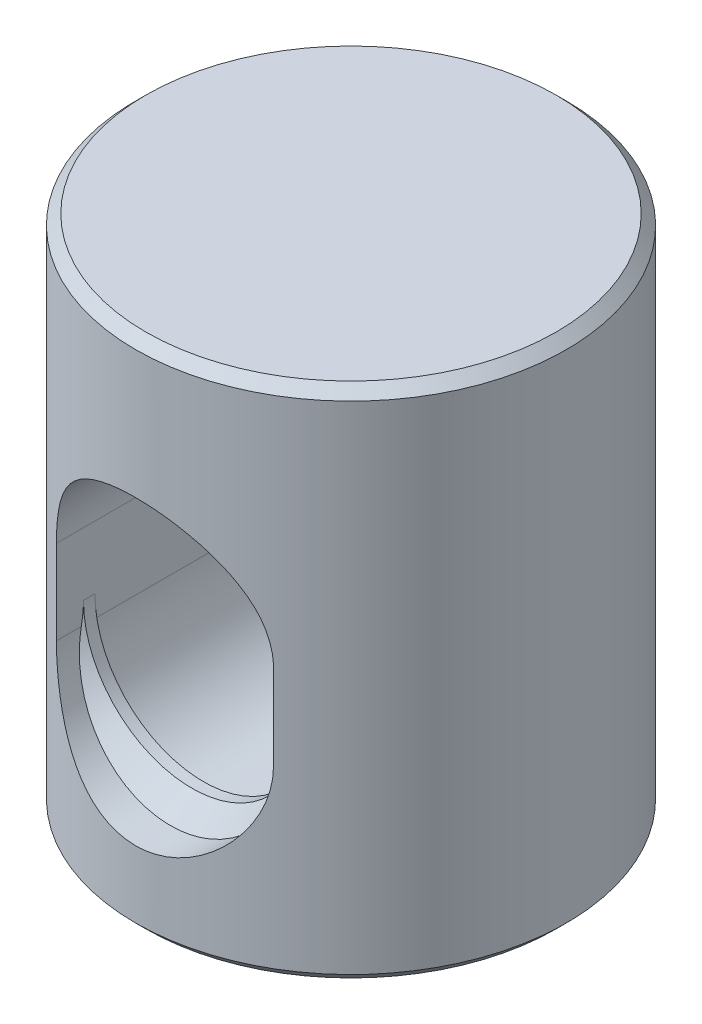
ISO-10303-21;
HEADER;
FILE_DESCRIPTION(('STEP AP214'),'2;1');
FILE_NAME('part.step','',(''),(''),'','','');
FILE_SCHEMA(('AUTOMOTIVE_DESIGN { 1 0 10303 214 1 1 1 1 }'));
ENDSEC;
DATA;
#1=APPLICATION_CONTEXT('core data for automotive mechanical design processes');
#2=APPLICATION_PROTOCOL_DEFINITION('international standard','automotive_design',2000,#1);
#3=PRODUCT_CONTEXT('',#1,'mechanical');
#4=PRODUCT('Part','Part','',(#3));
#5=PRODUCT_RELATED_PRODUCT_CATEGORY('part','',(#4));
#6=PRODUCT_DEFINITION_FORMATION('','',#4);
#7=PRODUCT_DEFINITION_CONTEXT('part definition',#1,'design');
#8=PRODUCT_DEFINITION('design','',#6,#7);
#9=PRODUCT_DEFINITION_SHAPE('','',#8);
#10=(LENGTH_UNIT() NAMED_UNIT(*) SI_UNIT(.MILLI.,.METRE.));
#11=(NAMED_UNIT(*) PLANE_ANGLE_UNIT() SI_UNIT($,.RADIAN.));
#12=(NAMED_UNIT(*) SI_UNIT($,.STERADIAN.) SOLID_ANGLE_UNIT());
#13=UNCERTAINTY_MEASURE_WITH_UNIT(LENGTH_MEASURE(1.E-05),#10,'distance_accuracy_value','');
#14=(GEOMETRIC_REPRESENTATION_CONTEXT(3) GLOBAL_UNCERTAINTY_ASSIGNED_CONTEXT((#13)) GLOBAL_UNIT_ASSIGNED_CONTEXT((#10,
#11,#12)) REPRESENTATION_CONTEXT('',''));
#15=CARTESIAN_POINT('',(0.,0.,0.));
#16=DIRECTION('',(0.,0.,1.));
#17=DIRECTION('',(1.,0.,0.));
#18=AXIS2_PLACEMENT_3D('',#15,#16,#17);
#19=CARTESIAN_POINT('',(0.,15.24,0.));
#20=DIRECTION('',(0.,-1.,0.));
#21=DIRECTION('',(0.,0.,-1.));
#22=AXIS2_PLACEMENT_3D('',#19,#20,#21);
#23=CYLINDRICAL_SURFACE('',#22,6.35);
#24=CARTESIAN_POINT('',(0.,0.300000000000012,0.));
#25=DIRECTION('',(0.,1.,0.));
#26=DIRECTION('',(0.,0.,1.));
#27=AXIS2_PLACEMENT_3D('',#24,#25,#26);
#28=CIRCLE('',#27,6.35);
#29=CARTESIAN_POINT('',(0.,0.300000000000012,6.35));
#30=VERTEX_POINT('',#29);
#31=EDGE_CURVE('E360',#30,#30,#28,.T.);
#32=ORIENTED_EDGE('',*,*,#31,.T.);
#33=EDGE_LOOP('',(#32));
#34=FACE_BOUND('',#33,.T.);
#35=CARTESIAN_POINT('',(0.,14.94,0.));
#36=DIRECTION('',(0.,1.,0.));
#37=DIRECTION('',(0.,0.,1.));
#38=AXIS2_PLACEMENT_3D('',#35,#36,#37);
#39=CIRCLE('',#38,6.35);
#40=CARTESIAN_POINT('',(0.,14.94,6.35));
#41=VERTEX_POINT('',#40);
#42=EDGE_CURVE('E260',#41,#41,#39,.F.);
#43=ORIENTED_EDGE('',*,*,#42,.T.);
#44=EDGE_LOOP('',(#43));
#45=FACE_BOUND('',#44,.T.);
#46=DIRECTION('',(0.,-1.,0.));
#47=VECTOR('',#46,1.);
#48=CARTESIAN_POINT('',(3.2004,15.24,5.48451819579441));
#49=LINE('',#48,#47);
#50=CARTESIAN_POINT('',(3.2004,7.96296381691838,5.48451819579441));
#51=VERTEX_POINT('',#50);
#52=CARTESIAN_POINT('',(3.2004,5.47376381691839,5.48451819579441));
#53=VERTEX_POINT('',#52);
#54=EDGE_CURVE('E323',#51,#53,#49,.T.);
#55=ORIENTED_EDGE('',*,*,#54,.T.);
#56=CARTESIAN_POINT('',(3.2004,5.47376381691839,5.48451819579441));
#57=CARTESIAN_POINT('',(3.20041520902536,5.39005199965933,5.48449322061247));
#58=CARTESIAN_POINT('',(3.19711609521049,5.30635408187406,5.48643413349997));
#59=CARTESIAN_POINT('',(3.18400896018501,5.13969204439521,5.49405961537088));
#60=CARTESIAN_POINT('',(3.17420501293031,5.05672749832797,5.49974184116526));
#61=CARTESIAN_POINT('',(3.14828323202816,4.89261017101105,5.51461890074698));
#62=CARTESIAN_POINT('',(3.13220242944823,4.8114496617991,5.5237931253167));
#63=CARTESIAN_POINT('',(3.09394053790969,4.65102430565194,5.54531450642794));
#64=CARTESIAN_POINT('',(3.0717587318152,4.57175968275794,5.55766203596096));
#65=CARTESIAN_POINT('',(2.99652270034001,4.33792381019741,5.59880664504087));
#66=CARTESIAN_POINT('',(2.93469640547812,4.18680593896513,5.6317555742814));
#67=CARTESIAN_POINT('',(2.7897444284642,3.89697972699356,5.70494487394591));
#68=CARTESIAN_POINT('',(2.7065851828588,3.75829141011306,5.74519670464981));
#69=CARTESIAN_POINT('',(2.51323770608714,3.48466268592874,5.83251973403245));
#70=CARTESIAN_POINT('',(2.40137654068711,3.35099367269663,5.87987966917263));
#71=CARTESIAN_POINT('',(2.15730197135361,3.10335125019217,5.97374636776074));
#72=CARTESIAN_POINT('',(2.02508299873944,2.98938324810154,6.02025289385955));
#73=CARTESIAN_POINT('',(1.73290070126351,2.77664460865887,6.11101485794577));
#74=CARTESIAN_POINT('',(1.57165365542979,2.67946147164897,6.15489459573024));
#75=CARTESIAN_POINT('',(1.23247156167235,2.51418725453053,6.23166593901807));
#76=CARTESIAN_POINT('',(1.05454715643542,2.44607777310111,6.26456449185763));
#77=CARTESIAN_POINT('',(0.700657533377402,2.34598995918221,6.3135686984548));
#78=CARTESIAN_POINT('',(0.525476355341838,2.31176021760063,6.33071428978728));
#79=CARTESIAN_POINT('',(0.171080993856966,2.27298119026403,6.35016927339731));
#80=CARTESIAN_POINT('',(-0.00813070434166761,2.26841409191865,6.35248756953939));
#81=CARTESIAN_POINT('',(-0.348541285139331,2.28823987151014,6.34251223547389));
#82=CARTESIAN_POINT('',(-0.509933100896632,2.3101105640801,6.33149107998425));
#83=CARTESIAN_POINT('',(-0.826389897083378,2.37766615729196,6.2980077559688));
#84=CARTESIAN_POINT('',(-0.981454523105129,2.42335238995521,6.27554494750421));
#85=CARTESIAN_POINT('',(-1.28353840976863,2.53751900553277,6.22084701388221));
#86=CARTESIAN_POINT('',(-1.43041885807273,2.60630219356663,6.18848260654502));
#87=CARTESIAN_POINT('',(-1.71090507374345,2.76427962589099,6.11688548974982));
#88=CARTESIAN_POINT('',(-1.84450589906419,2.85348142853425,6.07765023818021));
#89=CARTESIAN_POINT('',(-2.10826784413913,3.05955995787721,5.99155599301845));
#90=CARTESIAN_POINT('',(-2.23688028599883,3.17826672589359,5.94432675982627));
#91=CARTESIAN_POINT('',(-2.47322372003821,3.43507574816579,5.84994813553362));
#92=CARTESIAN_POINT('',(-2.58093539845394,3.57319574032218,5.80279885781512));
#93=CARTESIAN_POINT('',(-2.77941443378415,3.87618774753592,5.71052826545076));
#94=CARTESIAN_POINT('',(-2.86859541969828,4.04222343178092,5.66574587511273));
#95=CARTESIAN_POINT('',(-2.97986496162782,4.30249181580476,5.60755317221422));
#96=CARTESIAN_POINT('',(-3.01319221921256,4.39106482036819,5.58965986290572));
#97=CARTESIAN_POINT('',(-3.07201734030052,4.57140229489847,5.55754716941022));
#98=CARTESIAN_POINT('',(-3.09751825624147,4.66316550503245,5.5433263532177));
#99=CARTESIAN_POINT('',(-3.14579198551492,4.87301335466828,5.51610968460206));
#100=CARTESIAN_POINT('',(-3.16619715976677,4.99182508137017,5.504358329603));
#101=CARTESIAN_POINT('',(-3.18667870918506,5.17160794526524,5.49250697751061));
#102=CARTESIAN_POINT('',(-3.19181825016395,5.23186436455501,5.48951904322502));
#103=CARTESIAN_POINT('',(-3.19868021125493,5.35266181655497,5.48552216005222));
#104=CARTESIAN_POINT('',(-3.2004012042239,5.41320295756074,5.48451403768015));
#105=CARTESIAN_POINT('',(-3.2004,5.47376381691838,5.48451819579441));
#106=B_SPLINE_CURVE_WITH_KNOTS('',3,(#56,#57,#58,#59,#60,#61,#62,#63,#64,#65,#66,#67,#68,#69,
#70,#71,#72,#73,#74,#75,#76,#77,#78,#79,#80,#81,#82,#83,#84,#85,#86,#87,#88,#89,#90,#91,#92,#93,
#94,#95,#96,#97,#98,#99,#100,#101,#102,#103,#104,#105),.UNSPECIFIED.,.F.,.F.,(4,2,2,2,2,2,2,2,2,
2,2,2,2,2,2,2,2,2,2,2,2,2,2,2,4),(0.,0.251025201598788,0.501893335150696,0.751303283041319,
1.00074256009261,1.49809981011307,1.99624441090608,2.53582599156872,3.07555543262081,
3.65246126061753,4.22900140957668,4.76396393545721,5.29860518349389,5.78602567153319,
6.27347342429859,6.76757885089399,7.26186747698454,7.80338990036032,8.345410369809,
8.9231842497247,9.21175103862252,9.50020513695931,9.86246723499499,10.0440027069803,
10.2256139487637),.UNSPECIFIED.);
#107=CARTESIAN_POINT('',(-3.2004,5.47376381691839,5.48451819579441));
#108=VERTEX_POINT('',#107);
#109=EDGE_CURVE('E201',#53,#108,#106,.T.);
#110=ORIENTED_EDGE('',*,*,#109,.T.);
#111=DIRECTION('',(0.,-1.,0.));
#112=VECTOR('',#111,1.);
#113=CARTESIAN_POINT('',(-3.2004,15.24,5.48451819579441));
#114=LINE('',#113,#112);
#115=CARTESIAN_POINT('',(-3.2004,7.96296381691838,5.48451819579441));
#116=VERTEX_POINT('',#115);
#117=EDGE_CURVE('E214',#116,#108,#114,.T.);
#118=ORIENTED_EDGE('',*,*,#117,.F.);
#119=CARTESIAN_POINT('',(-3.2004,7.96296381691838,5.48451819579441));
#120=CARTESIAN_POINT('',(-3.20041520902536,8.04667563417744,5.48449322061247));
#121=CARTESIAN_POINT('',(-3.19711609521049,8.13037355196271,5.48643413349997));
#122=CARTESIAN_POINT('',(-3.18400896018501,8.29703558944157,5.49405961537088));
#123=CARTESIAN_POINT('',(-3.17420501293031,8.3800001355088,5.49974184116526));
#124=CARTESIAN_POINT('',(-3.14828323202816,8.54411746282572,5.51461890074698));
#125=CARTESIAN_POINT('',(-3.13220242944823,8.62527797203768,5.5237931253167));
#126=CARTESIAN_POINT('',(-3.09394053790969,8.78570332818483,5.54531450642794));
#127=CARTESIAN_POINT('',(-3.0717587318152,8.86496795107883,5.55766203596096));
#128=CARTESIAN_POINT('',(-2.99652270034001,9.09880382363936,5.59880664504087));
#129=CARTESIAN_POINT('',(-2.93469640547812,9.24992169487164,5.6317555742814));
#130=CARTESIAN_POINT('',(-2.78974442846419,9.53974790684321,5.70494487394591));
#131=CARTESIAN_POINT('',(-2.7065851828588,9.67843622372371,5.74519670464981));
#132=CARTESIAN_POINT('',(-2.51323770608714,9.95206494790803,5.83251973403245));
#133=CARTESIAN_POINT('',(-2.40137654068711,10.0857339611401,5.87987966917263));
#134=CARTESIAN_POINT('',(-2.15730197135361,10.3333763836446,5.97374636776074));
#135=CARTESIAN_POINT('',(-2.02508299873944,10.4473443857352,6.02025289385955));
#136=CARTESIAN_POINT('',(-1.73290070126351,10.6600830251779,6.11101485794577));
#137=CARTESIAN_POINT('',(-1.57165365542979,10.7572661621878,6.15489459573024));
#138=CARTESIAN_POINT('',(-1.23247156167234,10.9225403793062,6.23166593901807));
#139=CARTESIAN_POINT('',(-1.05454715643542,10.9906498607357,6.26456449185763));
#140=CARTESIAN_POINT('',(-0.700657533377399,11.0907376746546,6.3135686984548));
#141=CARTESIAN_POINT('',(-0.525476355341836,11.1249674162361,6.33071428978728));
#142=CARTESIAN_POINT('',(-0.171080993856964,11.1637464435727,6.35016927339731));
#143=CARTESIAN_POINT('',(0.00813070434166875,11.1683135419181,6.35248756953939));
#144=CARTESIAN_POINT('',(0.348541285139332,11.1484877623266,6.34251223547389));
#145=CARTESIAN_POINT('',(0.509933100896632,11.1266170697567,6.33149107998425));
#146=CARTESIAN_POINT('',(0.826389897083378,11.0590614765448,6.2980077559688));
#147=CARTESIAN_POINT('',(0.98145452310513,11.0133752438816,6.27554494750421));
#148=CARTESIAN_POINT('',(1.28353840976863,10.899208628304,6.22084701388221));
#149=CARTESIAN_POINT('',(1.43041885807273,10.8304254402701,6.18848260654502));
#150=CARTESIAN_POINT('',(1.71090507374345,10.6724480079458,6.11688548974982));
#151=CARTESIAN_POINT('',(1.84450589906419,10.5832462053025,6.07765023818021));
#152=CARTESIAN_POINT('',(2.10826784413913,10.3771676759596,5.99155599301845));
#153=CARTESIAN_POINT('',(2.23688028599883,10.2584609079432,5.94432675982627));
#154=CARTESIAN_POINT('',(2.47322372003821,10.001651885671,5.84994813553363));
#155=CARTESIAN_POINT('',(2.58093539845394,9.86353189351459,5.80279885781512));
#156=CARTESIAN_POINT('',(2.77941443378415,9.56053988630085,5.71052826545076));
#157=CARTESIAN_POINT('',(2.86859541969828,9.39450420205584,5.66574587511273));
#158=CARTESIAN_POINT('',(2.97986496162782,9.134235818032,5.60755317221422));
#159=CARTESIAN_POINT('',(3.01319221921256,9.04566281346857,5.58965986290572));
#160=CARTESIAN_POINT('',(3.07201734030052,8.8653253389383,5.55754716941022));
#161=CARTESIAN_POINT('',(3.09751825624147,8.77356212880431,5.5433263532177));
#162=CARTESIAN_POINT('',(3.14579198551492,8.56371427916849,5.51610968460206));
#163=CARTESIAN_POINT('',(3.16619715976677,8.4449025524666,5.504358329603));
#164=CARTESIAN_POINT('',(3.18667870918506,8.26511968857153,5.49250697751061));
#165=CARTESIAN_POINT('',(3.19181825016395,8.20486326928175,5.48951904322502));
#166=CARTESIAN_POINT('',(3.19868021125493,8.0840658172818,5.48552216005222));
#167=CARTESIAN_POINT('',(3.2004012042239,8.02352467627603,5.48451403768015));
#168=CARTESIAN_POINT('',(3.2004,7.96296381691838,5.48451819579441));
#169=B_SPLINE_CURVE_WITH_KNOTS('',3,(#119,#120,#121,#122,#123,#124,#125,#126,#127,#128,#129,
#130,#131,#132,#133,#134,#135,#136,#137,#138,#139,#140,#141,#142,#143,#144,#145,#146,#147,#148,
#149,#150,#151,#152,#153,#154,#155,#156,#157,#158,#159,#160,#161,#162,#163,#164,#165,#166,#167,
#168),.UNSPECIFIED.,.F.,.F.,(4,2,2,2,2,2,2,2,2,2,2,2,2,2,2,2,2,2,2,2,2,2,2,2,4),(0.,
0.251025201598788,0.501893335150699,0.75130328304132,1.00074256009261,1.49809981011307,
1.99624441090608,2.53582599156872,3.07555543262081,3.65246126061753,4.22900140957668,
4.76396393545721,5.29860518349389,5.78602567153319,6.27347342429859,6.76757885089399,
7.26186747698454,7.80338990036032,8.345410369809,8.92318424972471,9.21175103862252,
9.50020513695932,9.86246723499499,10.0440027069803,10.2256139487637),.UNSPECIFIED.);
#170=EDGE_CURVE('E208',#116,#51,#169,.T.);
#171=ORIENTED_EDGE('',*,*,#170,.T.);
#172=EDGE_LOOP('',(#55,#110,#118,#171));
#173=FACE_BOUND('',#172,.T.);
#174=DIRECTION('',(0.,-1.,0.));
#175=VECTOR('',#174,1.);
#176=CARTESIAN_POINT('',(3.2004,15.24,-5.48451819579441));
#177=LINE('',#176,#175);
#178=CARTESIAN_POINT('',(3.2004,7.96296381690808,-5.48451819579441));
#179=VERTEX_POINT('',#178);
#180=CARTESIAN_POINT('',(3.2004,5.47376381689446,-5.48451819579441));
#181=VERTEX_POINT('',#180);
#182=EDGE_CURVE('E125',#179,#181,#177,.T.);
#183=ORIENTED_EDGE('',*,*,#182,.F.);
#184=CARTESIAN_POINT('',(3.2004,7.96296381690808,-5.48451819579441));
#185=CARTESIAN_POINT('',(3.20041520902563,8.04667563416705,-5.48449322061231));
#186=CARTESIAN_POINT('',(3.19711609521104,8.13037355195224,-5.48643413349965));
#187=CARTESIAN_POINT('',(3.18400896018612,8.29703558943098,-5.49405961537024));
#188=CARTESIAN_POINT('',(3.17420501293171,8.38000013549817,-5.49974184116446));
#189=CARTESIAN_POINT('',(3.14828323203013,8.54411746281502,-5.51461890074585));
#190=CARTESIAN_POINT('',(3.1322024294505,8.62527797202696,-5.52379312531542));
#191=CARTESIAN_POINT('',(3.09394053791253,8.78570332817411,-5.54531450642635));
#192=CARTESIAN_POINT('',(3.07175873181834,8.86496795106813,-5.55766203595922));
#193=CARTESIAN_POINT('',(2.99652270034403,9.09880382362874,-5.59880664503872));
#194=CARTESIAN_POINT('',(2.93469640548273,9.24992169486112,-5.63175557427899));
#195=CARTESIAN_POINT('',(2.78974442846997,9.53974790683299,-5.70494487394308));
#196=CARTESIAN_POINT('',(2.70658518286516,9.67843622371367,-5.74519670464681));
#197=CARTESIAN_POINT('',(2.51323770609474,9.9520649478984,-5.83251973402917));
#198=CARTESIAN_POINT('',(2.40137654069538,10.0857339611308,-5.87987966916923));
#199=CARTESIAN_POINT('',(2.15730197136324,10.3333763836358,-5.97374636775725));
#200=CARTESIAN_POINT('',(2.02508299874975,10.4473443857268,-6.02025289385606));
#201=CARTESIAN_POINT('',(1.73290070127498,10.6600830251705,-6.11101485794251));
#202=CARTESIAN_POINT('',(1.57165365544169,10.7572661621811,-6.15489459572719));
#203=CARTESIAN_POINT('',(1.23247156168501,10.922540379301,-6.23166593901556));
#204=CARTESIAN_POINT('',(1.05454715644841,10.9906498607311,-6.26456449185544));
#205=CARTESIAN_POINT('',(0.700657533390645,11.0907376746516,-6.31356869845333));
#206=CARTESIAN_POINT('',(0.525476355355008,11.124967416234,-6.33071428978619));
#207=CARTESIAN_POINT('',(0.171080993869829,11.1637464435721,-6.35016927339697));
#208=CARTESIAN_POINT('',(-0.0081307043290376,11.1683135419182,-6.35248756953941));
#209=CARTESIAN_POINT('',(-0.348541285127142,11.148487762328,-6.34251223547456));
#210=CARTESIAN_POINT('',(-0.509933100884639,11.1266170697586,-6.33149107998522));
#211=CARTESIAN_POINT('',(-0.826389897071875,11.0590614765479,-6.29800775597032));
#212=CARTESIAN_POINT('',(-0.98145452309392,11.0133752438852,-6.27554494750597));
#213=CARTESIAN_POINT('',(-1.28353840975787,10.8992086283087,-6.22084701388443));
#214=CARTESIAN_POINT('',(-1.43041885806214,10.8304254402754,-6.18848260654747));
#215=CARTESIAN_POINT('',(-1.71090507373328,10.6724480079522,-6.11688548975267));
#216=CARTESIAN_POINT('',(-1.84450589905428,10.5832462053095,-6.07765023818322));
#217=CARTESIAN_POINT('',(-2.10826784412977,10.3771676759677,-5.99155599302174));
#218=CARTESIAN_POINT('',(-2.23688028598979,10.258460907952,-5.94432675982968));
#219=CARTESIAN_POINT('',(-2.4732237200299,10.001651885681,-5.84994813553714));
#220=CARTESIAN_POINT('',(-2.58093539844606,9.86353189352527,-5.80279885781863));
#221=CARTESIAN_POINT('',(-2.77941443377738,9.56053988631261,-5.71052826545406));
#222=CARTESIAN_POINT('',(-2.86859541969219,9.39450420206803,-5.66574587511583));
#223=CARTESIAN_POINT('',(-2.9798649616228,9.13423581804476,-5.60755317221689));
#224=CARTESIAN_POINT('',(-3.01319221920791,9.0456628134815,-5.58965986290822));
#225=CARTESIAN_POINT('',(-3.07201734029663,8.86532533895154,-5.55754716941238));
#226=CARTESIAN_POINT('',(-3.09751825623797,8.77356212881769,-5.54332635321965));
#227=CARTESIAN_POINT('',(-3.14579198551321,8.56371427917824,-5.51610968460304));
#228=CARTESIAN_POINT('',(-3.16619715976604,8.44490255247245,-5.50435832960343));
#229=CARTESIAN_POINT('',(-3.18667870918511,8.2651196885714,-5.49250697751058));
#230=CARTESIAN_POINT('',(-3.19181825016416,8.2048632692796,-5.48951904322491));
#231=CARTESIAN_POINT('',(-3.1986802112552,8.08406581727558,-5.48552216005206));
#232=CARTESIAN_POINT('',(-3.2004012042241,8.02352467626777,-5.48451403768004));
#233=CARTESIAN_POINT('',(-3.2004,7.96296381690809,-5.48451819579441));
#234=B_SPLINE_CURVE_WITH_KNOTS('',3,(#184,#185,#186,#187,#188,#189,#190,#191,#192,#193,#194,
#195,#196,#197,#198,#199,#200,#201,#202,#203,#204,#205,#206,#207,#208,#209,#210,#211,#212,#213,
#214,#215,#216,#217,#218,#219,#220,#221,#222,#223,#224,#225,#226,#227,#228,#229,#230,#231,#232,
#233),.UNSPECIFIED.,.F.,.F.,(4,2,2,2,2,2,2,2,2,2,2,2,2,2,2,2,2,2,2,2,2,2,2,2,4),(0.,
0.251025201598518,0.501893335150158,0.751303283040514,1.00074256009153,1.49809981011148,
1.99624441090397,2.53582599156581,3.07555543261711,3.65246126061389,4.22900140957311,
4.7639639354544,5.29860518349184,5.78602567153141,6.27347342429709,6.76757885089209,
7.26186747698224,7.80338990035736,8.34541036980537,8.92318424972106,9.21175103861887,
9.50020513695567,9.86246723500339,10.0440027069948,10.2256139487843),.UNSPECIFIED.);
#235=CARTESIAN_POINT('',(-3.2004,7.96296381690808,-5.48451819579441));
#236=VERTEX_POINT('',#235);
#237=EDGE_CURVE('E127',#179,#236,#234,.T.);
#238=ORIENTED_EDGE('',*,*,#237,.T.);
#239=DIRECTION('',(0.,-1.,0.));
#240=VECTOR('',#239,1.);
#241=CARTESIAN_POINT('',(-3.2004,15.24,-5.48451819579441));
#242=LINE('',#241,#240);
#243=CARTESIAN_POINT('',(-3.20040000002564,5.47376381689446,-5.48451819577945));
#244=VERTEX_POINT('',#243);
#245=EDGE_CURVE('E303',#236,#244,#242,.T.);
#246=ORIENTED_EDGE('',*,*,#245,.T.);
#247=CARTESIAN_POINT('',(3.2004,5.47376381689446,-5.48451819579441));
#248=CARTESIAN_POINT('',(3.20041520902473,5.39005199963519,-5.48449322061284));
#249=CARTESIAN_POINT('',(3.19711609520922,5.30635408184975,-5.48643413350071));
#250=CARTESIAN_POINT('',(3.18400896018244,5.13969204437061,-5.49405961537238));
#251=CARTESIAN_POINT('',(3.17420501292707,5.05672749830327,-5.49974184116713));
#252=CARTESIAN_POINT('',(3.14828323202358,4.89261017098621,-5.5146189007496));
#253=CARTESIAN_POINT('',(3.13220242944298,4.81144966177422,-5.52379312531968));
#254=CARTESIAN_POINT('',(3.09394053790307,4.65102430562705,-5.54531450643163));
#255=CARTESIAN_POINT('',(3.07175873180791,4.57175968273308,-5.557662035965));
#256=CARTESIAN_POINT('',(2.99652270033067,4.33792381017273,-5.59880664504589));
#257=CARTESIAN_POINT('',(2.93469640546742,4.18680593894069,-5.63175557428699));
#258=CARTESIAN_POINT('',(2.78974442845079,3.8969797269698,-5.70494487395249));
#259=CARTESIAN_POINT('',(2.70658518284405,3.75829141008974,-5.74519670465679));
#260=CARTESIAN_POINT('',(2.51323770606949,3.48466268590639,-5.83251973404009));
#261=CARTESIAN_POINT('',(2.40137654066788,3.35099367267484,-5.87987966918051));
#262=CARTESIAN_POINT('',(2.15730197133124,3.10335125017177,-5.97374636776885));
#263=CARTESIAN_POINT('',(2.02508299871549,2.98938324808197,-6.02025289386764));
#264=CARTESIAN_POINT('',(1.73290070123689,2.77664460864176,-6.11101485795335));
#265=CARTESIAN_POINT('',(1.57165365540214,2.67946147163341,-6.15489459573732));
#266=CARTESIAN_POINT('',(1.23247156164292,2.51418725451828,-6.23166593902391));
#267=CARTESIAN_POINT('',(1.05454715640525,2.4460777730906,-6.26456449186273));
#268=CARTESIAN_POINT('',(0.700657533346635,2.34598995917535,-6.31356869845821));
#269=CARTESIAN_POINT('',(0.525476355311241,2.31176021759558,-6.3307142897898));
#270=CARTESIAN_POINT('',(0.17108099382708,2.27298119026246,-6.35016927339811));
#271=CARTESIAN_POINT('',(-0.00813070437101219,2.26841409191876,-6.35248756953933));
#272=CARTESIAN_POINT('',(-0.348541285167653,2.28823987151325,-6.34251223547233));
#273=CARTESIAN_POINT('',(-0.509933100924496,2.31011056408461,-6.33149107998199));
#274=CARTESIAN_POINT('',(-0.826389897110103,2.3776661572991,-6.29800775596528));
#275=CARTESIAN_POINT('',(-0.981454523131173,2.42335238996361,-6.27554494750012));
#276=CARTESIAN_POINT('',(-1.28353840979363,2.53751900554369,-6.22084701387704));
#277=CARTESIAN_POINT('',(-1.43041885809733,2.60630219357889,-6.18848260653933));
#278=CARTESIAN_POINT('',(-1.71090507376706,2.76427962590589,-6.11688548974321));
#279=CARTESIAN_POINT('',(-1.84450589908722,2.85348142855044,-6.07765023817321));
#280=CARTESIAN_POINT('',(-2.10826784416087,3.05955995789616,-5.99155599301079));
#281=CARTESIAN_POINT('',(-2.23688028601983,3.17826672591402,-5.94432675981835));
#282=CARTESIAN_POINT('',(-2.4732237200575,3.43507574818915,-5.84994813552545));
#283=CARTESIAN_POINT('',(-2.58093539847225,3.57319574034699,-5.80279885780696));
#284=CARTESIAN_POINT('',(-2.77941443379986,3.87618774756324,-5.71052826544308));
#285=CARTESIAN_POINT('',(-2.86859541971242,4.04222343180925,-5.66574587510555));
#286=CARTESIAN_POINT('',(-2.97986496163947,4.3024918158344,-5.60755317220802));
#287=CARTESIAN_POINT('',(-3.01319221922335,4.39106482039823,-5.58965986289989));
#288=CARTESIAN_POINT('',(-3.07201734030956,4.57140229492922,-5.55754716940522));
#289=CARTESIAN_POINT('',(-3.09751825624961,4.66316550506353,-5.54332635321315));
#290=CARTESIAN_POINT('',(-3.1457919855189,4.87301335469094,-5.51610968459977));
#291=CARTESIAN_POINT('',(-3.16619715976849,4.99182508138376,-5.50435832960201));
#292=CARTESIAN_POINT('',(-3.18667870918494,5.17160794526493,-5.49250697751068));
#293=CARTESIAN_POINT('',(-3.19181825016349,5.23186436455,-5.4895190432253));
#294=CARTESIAN_POINT('',(-3.19868021125429,5.35266181654051,-5.48552216005259));
#295=CARTESIAN_POINT('',(-3.20040120422345,5.41320295754154,-5.48451403768042));
#296=CARTESIAN_POINT('',(-3.2004,5.47376381689446,-5.48451819579441));
#297=B_SPLINE_CURVE_WITH_KNOTS('',3,(#247,#248,#249,#250,#251,#252,#253,#254,#255,#256,#257,
#258,#259,#260,#261,#262,#263,#264,#265,#266,#267,#268,#269,#270,#271,#272,#273,#274,#275,#276,
#277,#278,#279,#280,#281,#282,#283,#284,#285,#286,#287,#288,#289,#290,#291,#292,#293,#294,#295,
#296),.UNSPECIFIED.,.F.,.F.,(4,2,2,2,2,2,2,2,2,2,2,2,2,2,2,2,2,2,2,2,2,2,2,2,4),(0.,
0.251025201599419,0.50189333515195,0.751303283043193,1.0007425600951,1.49809981011676,
1.99624441091099,2.53582599157548,3.07555543262941,3.65246126062599,4.22900140958497,
4.76396393546373,5.29860518349866,5.78602567153732,6.27347342430208,6.76757885089841,
7.2618674769899,7.80338990036722,8.34541036981743,8.92318424973318,9.21175103863101,
9.5002051369678,9.8624672349755,10.0440027069466,10.2256139487159),.UNSPECIFIED.);
#298=EDGE_CURVE('E129',#181,#244,#297,.T.);
#299=ORIENTED_EDGE('',*,*,#298,.F.);
#300=EDGE_LOOP('',(#183,#238,#246,#299));
#301=FACE_BOUND('',#300,.T.);
#302=ADVANCED_FACE('F35',(#34,#45,#173,#301),#23,.T.);
#303=CARTESIAN_POINT('',(0.,7.32796381691838,-6.351));
#304=DIRECTION('',(0.,0.,1.));
#305=DIRECTION('',(1.,0.,0.));
#306=AXIS2_PLACEMENT_3D('',#303,#304,#305);
#307=CYLINDRICAL_SURFACE('',#306,3.2004);
#308=DIRECTION('',(0.,0.,1.));
#309=VECTOR('',#308,1.);
#310=CARTESIAN_POINT('',(3.2004,7.32796381691838,-6.351));
#311=LINE('',#310,#309);
#312=CARTESIAN_POINT('',(3.2004,7.32796381691838,0.35));
#313=VERTEX_POINT('',#312);
#314=CARTESIAN_POINT('',(3.2004,7.32796381691838,0.857999999999994));
#315=VERTEX_POINT('',#314);
#316=EDGE_CURVE('E300',#313,#315,#311,.T.);
#317=ORIENTED_EDGE('',*,*,#316,.T.);
#318=CARTESIAN_POINT('',(0.,7.32796381691838,0.857999999999994));
#319=DIRECTION('',(0.,0.,-1.));
#320=DIRECTION('',(-1.,0.,0.));
#321=AXIS2_PLACEMENT_3D('',#318,#319,#320);
#322=CIRCLE('',#321,3.2004);
#323=CARTESIAN_POINT('',(-3.2004,7.32796381691838,0.857999999999994));
#324=VERTEX_POINT('',#323);
#325=EDGE_CURVE('E331',#315,#324,#322,.F.);
#326=ORIENTED_EDGE('',*,*,#325,.T.);
#327=DIRECTION('',(0.,0.,1.));
#328=VECTOR('',#327,1.);
#329=CARTESIAN_POINT('',(-3.2004,7.32796381691838,-6.351));
#330=LINE('',#329,#328);
#331=CARTESIAN_POINT('',(-3.20040000002564,7.32796381691969,0.35));
#332=VERTEX_POINT('',#331);
#333=EDGE_CURVE('E133',#332,#324,#330,.T.);
#334=ORIENTED_EDGE('',*,*,#333,.F.);
#335=CARTESIAN_POINT('',(0.,7.32796381691838,0.35));
#336=DIRECTION('',(0.,0.,-1.));
#337=DIRECTION('',(-1.,0.,0.));
#338=AXIS2_PLACEMENT_3D('',#335,#336,#337);
#339=CIRCLE('',#338,3.2004);
#340=EDGE_CURVE('E345',#332,#313,#339,.T.);
#341=ORIENTED_EDGE('',*,*,#340,.T.);
#342=EDGE_LOOP('',(#317,#326,#334,#341));
#343=FACE_BOUND('',#342,.T.);
#344=ADVANCED_FACE('F182',(#343),#307,.F.);
#345=CARTESIAN_POINT('',(0.,15.24,0.));
#346=DIRECTION('',(0.,1.,0.));
#347=DIRECTION('',(0.,0.,1.));
#348=AXIS2_PLACEMENT_3D('',#345,#346,#347);
#349=PLANE('',#348);
#350=CARTESIAN_POINT('',(0.,15.24,0.));
#351=DIRECTION('',(0.,1.,0.));
#352=DIRECTION('',(0.,0.,1.));
#353=AXIS2_PLACEMENT_3D('',#350,#351,#352);
#354=CIRCLE('',#353,6.05000000000001);
#355=CARTESIAN_POINT('',(0.,15.24,6.05000000000001));
#356=VERTEX_POINT('',#355);
#357=EDGE_CURVE('E12',#356,#356,#354,.T.);
#358=ORIENTED_EDGE('',*,*,#357,.T.);
#359=EDGE_LOOP('',(#358));
#360=FACE_BOUND('',#359,.T.);
#361=ADVANCED_FACE('F188',(#360),#349,.T.);
#362=CARTESIAN_POINT('',(0.,0.,0.));
#363=DIRECTION('',(0.,1.,0.));
#364=DIRECTION('',(0.,0.,1.));
#365=AXIS2_PLACEMENT_3D('',#362,#363,#364);
#366=PLANE('',#365);
#367=CARTESIAN_POINT('',(0.,0.,0.));
#368=DIRECTION('',(0.,1.,0.));
#369=DIRECTION('',(0.,0.,1.));
#370=AXIS2_PLACEMENT_3D('',#367,#368,#369);
#371=CIRCLE('',#370,6.04999999999998);
#372=CARTESIAN_POINT('',(0.,0.,6.04999999999998));
#373=VERTEX_POINT('',#372);
#374=EDGE_CURVE('E43',#373,#373,#371,.F.);
#375=ORIENTED_EDGE('',*,*,#374,.T.);
#376=EDGE_LOOP('',(#375));
#377=FACE_BOUND('',#376,.T.);
#378=ADVANCED_FACE('F195',(#377),#366,.F.);
#379=CARTESIAN_POINT('',(-3.2004,5.47376381691839,-6.60455798469295));
#380=DIRECTION('',(1.,0.,0.));
#381=DIRECTION('',(0.,0.,-1.));
#382=AXIS2_PLACEMENT_3D('',#379,#380,#381);
#383=PLANE('',#382);
#384=ORIENTED_EDGE('',*,*,#333,.T.);
#385=CARTESIAN_POINT('',(-3.2004,7.32796381691838,0.857999999999994));
#386=CARTESIAN_POINT('',(-3.2004,7.38128340021513,0.857992404076494));
#387=CARTESIAN_POINT('',(-3.2004,7.43460083480916,0.859332425487074));
#388=CARTESIAN_POINT('',(-3.2004,7.54098065085831,0.864644302715578));
#389=CARTESIAN_POINT('',(-3.2004,7.59404333708618,0.868610036566385));
#390=CARTESIAN_POINT('',(-3.2004,7.69990768003059,0.879110035522266));
#391=CARTESIAN_POINT('',(-3.2004,7.75270935693813,0.885644098696982));
#392=CARTESIAN_POINT('',(-3.2004,7.85807390744557,0.901185515225096));
#393=CARTESIAN_POINT('',(-3.2004,7.91063593846003,0.910198593446682));
#394=CARTESIAN_POINT('',(-3.2004,7.96296381691838,0.920387942848869));
#395=B_SPLINE_CURVE_WITH_KNOTS('',3,(#385,#386,#387,#388,#389,#390,#391,#392,#393,#394),
.UNSPECIFIED.,.F.,.F.,(4,2,2,2,4),(0.,0.159938601208116,0.319505605352361,0.479060066331304,
0.638986130805498),.UNSPECIFIED.);
#396=CARTESIAN_POINT('',(-3.2004,7.96296381691838,0.920387942848869));
#397=VERTEX_POINT('',#396);
#398=EDGE_CURVE('E235',#324,#397,#395,.T.);
#399=ORIENTED_EDGE('',*,*,#398,.T.);
#400=DIRECTION('',(0.,0.,1.));
#401=VECTOR('',#400,1.);
#402=CARTESIAN_POINT('',(-3.2004,7.96296381691838,-6.60455798469295));
#403=LINE('',#402,#401);
#404=EDGE_CURVE('E316',#397,#116,#403,.T.);
#405=ORIENTED_EDGE('',*,*,#404,.T.);
#406=ORIENTED_EDGE('',*,*,#117,.T.);
#407=DIRECTION('',(0.,0.,1.));
#408=VECTOR('',#407,1.);
#409=CARTESIAN_POINT('',(-3.2004,5.47376381691839,-6.60455798469295));
#410=LINE('',#409,#408);
#411=CARTESIAN_POINT('',(-3.2004,5.47376381691839,4.75038794284887));
#412=VERTEX_POINT('',#411);
#413=EDGE_CURVE('E50',#412,#108,#410,.T.);
#414=ORIENTED_EDGE('',*,*,#413,.F.);
#415=CARTESIAN_POINT('',(-3.2004,5.47376381691839,4.75038794284887));
#416=CARTESIAN_POINT('',(-3.2004,5.51087604747312,4.74316502457424));
#417=CARTESIAN_POINT('',(-3.2004,5.54810167011868,4.73653008412525));
#418=CARTESIAN_POINT('',(-3.2004,5.6226891723518,4.72449280511048));
#419=CARTESIAN_POINT('',(-3.2004,5.66005073086517,4.7190884747001));
#420=CARTESIAN_POINT('',(-3.2004,5.76556909712921,4.70564223201423));
#421=CARTESIAN_POINT('',(-3.2004,5.8339182879004,4.69905866171353));
#422=CARTESIAN_POINT('',(-3.2004,5.97109835190056,4.69022004801861));
#423=CARTESIAN_POINT('',(-3.2004,6.03993005278882,4.68797791633222));
#424=CARTESIAN_POINT('',(-3.2004,6.10876381691838,4.68799999999999));
#425=B_SPLINE_CURVE_WITH_KNOTS('',3,(#415,#416,#417,#418,#419,#420,#421,#422,#423,#424),
.UNSPECIFIED.,.F.,.F.,(4,2,2,2,4),(0.,0.113418160066041,0.226651417446491,0.432504309459828,
0.638968486052717),.UNSPECIFIED.);
#426=CARTESIAN_POINT('',(-3.2004,6.10876381691838,4.68799999999999));
#427=VERTEX_POINT('',#426);
#428=EDGE_CURVE('E234',#412,#427,#425,.T.);
#429=ORIENTED_EDGE('',*,*,#428,.T.);
#430=DIRECTION('',(0.,0.,1.));
#431=VECTOR('',#430,1.);
#432=CARTESIAN_POINT('',(-3.2004,6.10876381691838,-6.351));
#433=LINE('',#432,#431);
#434=CARTESIAN_POINT('',(-3.2004,6.10876381691838,4.35));
#435=VERTEX_POINT('',#434);
#436=EDGE_CURVE('E306',#435,#427,#433,.T.);
#437=ORIENTED_EDGE('',*,*,#436,.F.);
#438=DIRECTION('',(0.,1.,0.));
#439=VECTOR('',#438,1.);
#440=CARTESIAN_POINT('',(-3.20040000002564,-291583.998,4.35));
#441=LINE('',#440,#439);
#442=CARTESIAN_POINT('',(-3.2004,5.47376381689446,4.35));
#443=VERTEX_POINT('',#442);
#444=EDGE_CURVE('E293',#443,#435,#441,.T.);
#445=ORIENTED_EDGE('',*,*,#444,.F.);
#446=DIRECTION('',(0.,0.,1.));
#447=VECTOR('',#446,1.);
#448=CARTESIAN_POINT('',(-3.2004,5.47376381689446,-6.351));
#449=LINE('',#448,#447);
#450=EDGE_CURVE('E291',#244,#443,#449,.T.);
#451=ORIENTED_EDGE('',*,*,#450,.F.);
#452=ORIENTED_EDGE('',*,*,#245,.F.);
#453=DIRECTION('',(0.,0.,1.));
#454=VECTOR('',#453,1.);
#455=CARTESIAN_POINT('',(-3.2004,7.96296381690808,-6.351));
#456=LINE('',#455,#454);
#457=CARTESIAN_POINT('',(-3.2004,7.96296381690808,0.35));
#458=VERTEX_POINT('',#457);
#459=EDGE_CURVE('E142',#236,#458,#456,.T.);
#460=ORIENTED_EDGE('',*,*,#459,.T.);
#461=DIRECTION('',(0.,-1.,0.));
#462=VECTOR('',#461,1.);
#463=CARTESIAN_POINT('',(-3.20040000002564,-291586.811264071,0.35));
#464=LINE('',#463,#462);
#465=EDGE_CURVE('E151',#458,#332,#464,.T.);
#466=ORIENTED_EDGE('',*,*,#465,.T.);
#467=EDGE_LOOP('',(#384,#399,#405,#406,#414,#429,#437,#445,#451,#452,#460,#466));
#468=FACE_BOUND('',#467,.T.);
#469=ADVANCED_FACE('F221',(#468),#383,.T.);
#470=CARTESIAN_POINT('',(0.,7.96296381691838,-6.60455798469295));
#471=DIRECTION('',(0.,0.,1.));
#472=DIRECTION('',(1.,0.,0.));
#473=AXIS2_PLACEMENT_3D('',#470,#471,#472);
#474=CYLINDRICAL_SURFACE('',#473,3.2004);
#475=ORIENTED_EDGE('',*,*,#404,.F.);
#476=CARTESIAN_POINT('',(-3.2004,7.96296381691838,0.920387942848869));
#477=CARTESIAN_POINT('',(-3.2004002196008,8.04225079987243,0.935819080437646));
#478=CARTESIAN_POINT('',(-3.19745256396674,8.12153325361063,0.951139004957536));
#479=CARTESIAN_POINT('',(-3.18567509329493,8.27970685703353,0.981495114925205));
#480=CARTESIAN_POINT('',(-3.17684582043897,8.35859804211107,0.996531326394976));
#481=CARTESIAN_POINT('',(-3.14155028738469,8.59416580507911,1.04113281751642));
#482=CARTESIAN_POINT('',(-3.10627632310074,8.74970356299743,1.07018453667035));
#483=CARTESIAN_POINT('',(-3.0058325052118,9.07699712330453,1.13058894552511));
#484=CARTESIAN_POINT('',(-2.93696882213984,9.24768112476617,1.16163208307513));
#485=CARTESIAN_POINT('',(-2.770757594292,9.5751586231717,1.22048360818791));
#486=CARTESIAN_POINT('',(-2.67341360747684,9.73195385201355,1.248292399202));
#487=CARTESIAN_POINT('',(-2.45422325568562,10.0251075341517,1.29976460504816));
#488=CARTESIAN_POINT('',(-2.33268926288555,10.1616913322256,1.32347431949067));
#489=CARTESIAN_POINT('',(-2.06774164313115,10.4125100113924,1.36666675571466));
#490=CARTESIAN_POINT('',(-1.92432734952161,10.5267442112892,1.38614934865919));
#491=CARTESIAN_POINT('',(-1.62202478692731,10.7277512066566,1.42022564971931));
#492=CARTESIAN_POINT('',(-1.46340190064911,10.8149114409663,1.43488852610457));
#493=CARTESIAN_POINT('',(-1.13344301673195,10.9613697819241,1.45943007407591));
#494=CARTESIAN_POINT('',(-0.962108625665421,11.0206714026238,1.46930934906447));
#495=CARTESIAN_POINT('',(-0.613830095126756,11.1090181978213,1.48399879611383));
#496=CARTESIAN_POINT('',(-0.436979629331808,11.138422889391,1.48886920922471));
#497=CARTESIAN_POINT('',(-0.0807842638154728,11.1673292867907,1.49365724642694));
#498=CARTESIAN_POINT('',(0.0985605778223593,11.1668316877582,1.49357498565291));
#499=CARTESIAN_POINT('',(0.453518642376352,11.1360427295873,1.48847478936172));
#500=CARTESIAN_POINT('',(0.629147739494105,11.1059290406606,1.48348628692688));
#501=CARTESIAN_POINT('',(0.972798647868714,11.0170953660222,1.46871354566015));
#502=CARTESIAN_POINT('',(1.14082054814837,10.9583757151648,1.45892936296531));
#503=CARTESIAN_POINT('',(1.46483707448145,10.8139857966696,1.434732399735));
#504=CARTESIAN_POINT('',(1.62081050436366,10.7282693218338,1.42031168251561));
#505=CARTESIAN_POINT('',(1.91611459383942,10.5324874085884,1.38712473557141));
#506=CARTESIAN_POINT('',(2.0554450392883,10.4224216569295,1.36835844994145));
#507=CARTESIAN_POINT('',(2.31486266785415,10.180113038522,1.32666015191888));
#508=CARTESIAN_POINT('',(2.43477041455587,10.0476841843788,1.3036930571329));
#509=CARTESIAN_POINT('',(2.65070801069139,9.76516380203668,1.25415275326981));
#510=CARTESIAN_POINT('',(2.74673177375135,9.61506778602804,1.22757862767158));
#511=CARTESIAN_POINT('',(2.91360186574694,9.29931605518181,1.17096941949677));
#512=CARTESIAN_POINT('',(2.98407331171396,9.13347046816487,1.14089074377349));
#513=CARTESIAN_POINT('',(3.09611943886754,8.79283134659667,1.07822778494372));
#514=CARTESIAN_POINT('',(3.13772158906068,8.61804648825577,1.04564591649912));
#515=CARTESIAN_POINT('',(3.1764329982542,8.36207670641777,0.997193592028514));
#516=CARTESIAN_POINT('',(3.18542712744629,8.28240189131931,0.982010682814864));
#517=CARTESIAN_POINT('',(3.19740351282712,8.12281033790333,0.951385711036181));
#518=CARTESIAN_POINT('',(3.2003972707034,8.04289435706284,0.935944201593524));
#519=CARTESIAN_POINT('',(3.2004,7.9629638169184,0.920387942848787));
#520=B_SPLINE_CURVE_WITH_KNOTS('',3,(#476,#477,#478,#479,#480,#481,#482,#483,#484,#485,#486,
#487,#488,#489,#490,#491,#492,#493,#494,#495,#496,#497,#498,#499,#500,#501,#502,#503,#504,#505,
#506,#507,#508,#509,#510,#511,#512,#513,#514,#515,#516,#517,#518,#519),.UNSPECIFIED.,.F.,.F.,(4,
2,2,2,2,2,2,2,2,2,2,2,2,2,2,2,2,2,2,2,2,4),(0.,0.242218601457185,0.484414877702795,
0.968907383139612,1.52615180969891,2.08332665105172,2.6337256360615,3.18414139413442,
3.72627295893097,4.26833612153914,4.80380088508776,5.33925320071361,5.87151275205617,
6.40376607304979,6.93693538419533,7.47011155487214,8.0079626159263,8.54595059787792,
9.09153946305883,9.6366084884177,9.88124093999875,10.125404022748),.UNSPECIFIED.);
#521=CARTESIAN_POINT('',(3.2004,7.96296381691838,0.920387942848869));
#522=VERTEX_POINT('',#521);
#523=EDGE_CURVE('E227',#397,#522,#520,.T.);
#524=ORIENTED_EDGE('',*,*,#523,.T.);
#525=DIRECTION('',(0.,0.,1.));
#526=VECTOR('',#525,1.);
#527=CARTESIAN_POINT('',(3.2004,7.96296381691838,-6.60455798469295));
#528=LINE('',#527,#526);
#529=EDGE_CURVE('E314',#522,#51,#528,.T.);
#530=ORIENTED_EDGE('',*,*,#529,.T.);
#531=ORIENTED_EDGE('',*,*,#170,.F.);
#532=EDGE_LOOP('',(#475,#524,#530,#531));
#533=FACE_BOUND('',#532,.T.);
#534=ADVANCED_FACE('F216',(#533),#474,.F.);
#535=CARTESIAN_POINT('',(3.2004,5.47376381691839,-6.60455798469295));
#536=DIRECTION('',(1.,0.,0.));
#537=DIRECTION('',(0.,0.,-1.));
#538=AXIS2_PLACEMENT_3D('',#535,#536,#537);
#539=PLANE('',#538);
#540=DIRECTION('',(0.,0.,1.));
#541=VECTOR('',#540,1.);
#542=CARTESIAN_POINT('',(3.2004,5.47376381691839,-6.60455798469295));
#543=LINE('',#542,#541);
#544=CARTESIAN_POINT('',(3.2004,5.47376381691839,4.75038794284887));
#545=VERTEX_POINT('',#544);
#546=EDGE_CURVE('E58',#545,#53,#543,.T.);
#547=ORIENTED_EDGE('',*,*,#546,.T.);
#548=ORIENTED_EDGE('',*,*,#54,.F.);
#549=ORIENTED_EDGE('',*,*,#529,.F.);
#550=CARTESIAN_POINT('',(3.2004,7.96296381691838,0.920387942848869));
#551=CARTESIAN_POINT('',(3.2004,7.92585158636365,0.913165024574243));
#552=CARTESIAN_POINT('',(3.2004,7.88862596371808,0.906530084125255));
#553=CARTESIAN_POINT('',(3.2004,7.81403846148497,0.894492805110479));
#554=CARTESIAN_POINT('',(3.2004,7.77667690297159,0.889088474700102));
#555=CARTESIAN_POINT('',(3.2004,7.67115853670756,0.875642232014235));
#556=CARTESIAN_POINT('',(3.2004,7.60280934593637,0.869058661713533));
#557=CARTESIAN_POINT('',(3.2004,7.46562928193621,0.860220048018615));
#558=CARTESIAN_POINT('',(3.2004,7.39679758104795,0.857977916332221));
#559=CARTESIAN_POINT('',(3.2004,7.32796381691839,0.857999999999987));
#560=B_SPLINE_CURVE_WITH_KNOTS('',3,(#550,#551,#552,#553,#554,#555,#556,#557,#558,#559),
.UNSPECIFIED.,.F.,.F.,(4,2,2,2,4),(0.,0.113418160066042,0.226651417446491,0.432504309459827,
0.638968486052717),.UNSPECIFIED.);
#561=EDGE_CURVE('E330',#522,#315,#560,.T.);
#562=ORIENTED_EDGE('',*,*,#561,.T.);
#563=ORIENTED_EDGE('',*,*,#316,.F.);
#564=DIRECTION('',(0.,-1.,0.));
#565=VECTOR('',#564,1.);
#566=CARTESIAN_POINT('',(3.20040000002564,-291586.811264071,0.35));
#567=LINE('',#566,#565);
#568=CARTESIAN_POINT('',(3.2004,7.96296381690809,0.35));
#569=VERTEX_POINT('',#568);
#570=EDGE_CURVE('E147',#569,#313,#567,.T.);
#571=ORIENTED_EDGE('',*,*,#570,.F.);
#572=DIRECTION('',(0.,0.,1.));
#573=VECTOR('',#572,1.);
#574=CARTESIAN_POINT('',(3.2004,7.96296381690809,-6.351));
#575=LINE('',#574,#573);
#576=EDGE_CURVE('E140',#179,#569,#575,.T.);
#577=ORIENTED_EDGE('',*,*,#576,.F.);
#578=ORIENTED_EDGE('',*,*,#182,.T.);
#579=DIRECTION('',(0.,0.,1.));
#580=VECTOR('',#579,1.);
#581=CARTESIAN_POINT('',(3.2004,5.47376381689446,-6.351));
#582=LINE('',#581,#580);
#583=CARTESIAN_POINT('',(3.2004,5.47376381689446,4.35));
#584=VERTEX_POINT('',#583);
#585=EDGE_CURVE('E134',#181,#584,#582,.T.);
#586=ORIENTED_EDGE('',*,*,#585,.T.);
#587=DIRECTION('',(0.,1.,0.));
#588=VECTOR('',#587,1.);
#589=CARTESIAN_POINT('',(3.20040000002564,-291583.998,4.35));
#590=LINE('',#589,#588);
#591=CARTESIAN_POINT('',(3.2004,6.10876381691838,4.35));
#592=VERTEX_POINT('',#591);
#593=EDGE_CURVE('E283',#584,#592,#590,.T.);
#594=ORIENTED_EDGE('',*,*,#593,.T.);
#595=DIRECTION('',(0.,0.,1.));
#596=VECTOR('',#595,1.);
#597=CARTESIAN_POINT('',(3.2004,6.10876381691838,-6.351));
#598=LINE('',#597,#596);
#599=CARTESIAN_POINT('',(3.2004,6.10876381691838,4.68799999999999));
#600=VERTEX_POINT('',#599);
#601=EDGE_CURVE('E304',#592,#600,#598,.T.);
#602=ORIENTED_EDGE('',*,*,#601,.T.);
#603=CARTESIAN_POINT('',(3.2004,6.10876381691838,4.68799999999999));
#604=CARTESIAN_POINT('',(3.2004,6.05544423362164,4.68799240407649));
#605=CARTESIAN_POINT('',(3.2004,6.00212679902761,4.68933242548707));
#606=CARTESIAN_POINT('',(3.2004,5.89574698297846,4.69464430271558));
#607=CARTESIAN_POINT('',(3.2004,5.84268429675059,4.69861003656639));
#608=CARTESIAN_POINT('',(3.2004,5.73681995380618,4.70911003552227));
#609=CARTESIAN_POINT('',(3.2004,5.68401827689864,4.71564409869698));
#610=CARTESIAN_POINT('',(3.2004,5.5786537263912,4.7311855152251));
#611=CARTESIAN_POINT('',(3.2004,5.52609169537674,4.74019859344668));
#612=CARTESIAN_POINT('',(3.2004,5.47376381691839,4.75038794284887));
#613=B_SPLINE_CURVE_WITH_KNOTS('',3,(#603,#604,#605,#606,#607,#608,#609,#610,#611,#612),
.UNSPECIFIED.,.F.,.F.,(4,2,2,2,4),(0.,0.159938601208116,0.319505605352361,0.479060066331304,
0.638986130805498),.UNSPECIFIED.);
#614=EDGE_CURVE('E244',#600,#545,#613,.T.);
#615=ORIENTED_EDGE('',*,*,#614,.T.);
#616=EDGE_LOOP('',(#547,#548,#549,#562,#563,#571,#577,#578,#586,#594,#602,#615));
#617=FACE_BOUND('',#616,.T.);
#618=ADVANCED_FACE('F145',(#617),#539,.F.);
#619=CARTESIAN_POINT('',(0.,5.47376381691839,-6.60455798469295));
#620=DIRECTION('',(0.,0.,1.));
#621=DIRECTION('',(1.,0.,0.));
#622=AXIS2_PLACEMENT_3D('',#619,#620,#621);
#623=CYLINDRICAL_SURFACE('',#622,3.2004);
#624=ORIENTED_EDGE('',*,*,#546,.F.);
#625=CARTESIAN_POINT('',(3.2004,5.47376381691839,4.75038794284887));
#626=CARTESIAN_POINT('',(3.2004002196008,5.39447683396434,4.76581908043765));
#627=CARTESIAN_POINT('',(3.19745256396674,5.31519438022614,4.78113900495754));
#628=CARTESIAN_POINT('',(3.18567509329493,5.15702077680324,4.8114951149252));
#629=CARTESIAN_POINT('',(3.17684582043897,5.07812959172569,4.82653132639498));
#630=CARTESIAN_POINT('',(3.14155028738469,4.84256182875766,4.87113281751642));
#631=CARTESIAN_POINT('',(3.10627632310074,4.68702407083934,4.90018453667035));
#632=CARTESIAN_POINT('',(3.0058325052118,4.35973051053224,4.96058894552511));
#633=CARTESIAN_POINT('',(2.93696882213984,4.1890465090706,4.99163208307513));
#634=CARTESIAN_POINT('',(2.770757594292,3.86156901066507,5.05048360818791));
#635=CARTESIAN_POINT('',(2.67341360747684,3.70477378182322,5.078292399202));
#636=CARTESIAN_POINT('',(2.45422325568562,3.41162009968505,5.12976460504816));
#637=CARTESIAN_POINT('',(2.33268926288555,3.27503630161117,5.15347431949067));
#638=CARTESIAN_POINT('',(2.06774164313115,3.02421762244442,5.19666675571466));
#639=CARTESIAN_POINT('',(1.92432734952161,2.90998342254757,5.21614934865919));
#640=CARTESIAN_POINT('',(1.62202478692731,2.70897642718014,5.25022564971931));
#641=CARTESIAN_POINT('',(1.46340190064911,2.6218161928705,5.26488852610457));
#642=CARTESIAN_POINT('',(1.13344301673195,2.47535785191269,5.28943007407591));
#643=CARTESIAN_POINT('',(0.96210862566542,2.41605623121298,5.29930934906447));
#644=CARTESIAN_POINT('',(0.613830095126754,2.32770943601543,5.31399879611383));
#645=CARTESIAN_POINT('',(0.436979629331807,2.2983047444458,5.31886920922471));
#646=CARTESIAN_POINT('',(0.0807842638154718,2.26939834704603,5.32365724642694));
#647=CARTESIAN_POINT('',(-0.0985605778223604,2.26989594607854,5.32357498565291));
#648=CARTESIAN_POINT('',(-0.453518642376353,2.30068490424942,5.31847478936172));
#649=CARTESIAN_POINT('',(-0.629147739494105,2.33079859317617,5.31348628692688));
#650=CARTESIAN_POINT('',(-0.972798647868714,2.41963226781462,5.29871354566015));
#651=CARTESIAN_POINT('',(-1.14082054814837,2.47835191867201,5.28892936296531));
#652=CARTESIAN_POINT('',(-1.46483707448145,2.62274183716718,5.264732399735));
#653=CARTESIAN_POINT('',(-1.62081050436366,2.70845831200296,5.25031168251561));
#654=CARTESIAN_POINT('',(-1.91611459383942,2.90424022524834,5.21712473557141));
#655=CARTESIAN_POINT('',(-2.0554450392883,3.01430597690724,5.19835844994145));
#656=CARTESIAN_POINT('',(-2.31486266785415,3.25661459531472,5.15666015191888));
#657=CARTESIAN_POINT('',(-2.43477041455587,3.38904344945796,5.1336930571329));
#658=CARTESIAN_POINT('',(-2.65070801069139,3.67156383180009,5.08415275326981));
#659=CARTESIAN_POINT('',(-2.74673177375135,3.82165984780873,5.05757862767158));
#660=CARTESIAN_POINT('',(-2.91360186574694,4.13741157865496,5.00096941949677));
#661=CARTESIAN_POINT('',(-2.98407331171396,4.3032571656719,4.97089074377349));
#662=CARTESIAN_POINT('',(-3.09611943886754,4.6438962872401,4.90822778494372));
#663=CARTESIAN_POINT('',(-3.13772158906068,4.818681145581,4.87564591649912));
#664=CARTESIAN_POINT('',(-3.1764329982542,5.07465092741901,4.82719359202851));
#665=CARTESIAN_POINT('',(-3.18542712744629,5.15432574251746,4.81201068281486));
#666=CARTESIAN_POINT('',(-3.19740351282712,5.31391729593344,4.78138571103618));
#667=CARTESIAN_POINT('',(-3.2003972707034,5.39383327677393,4.76594420159352));
#668=CARTESIAN_POINT('',(-3.2004,5.47376381691837,4.75038794284879));
#669=B_SPLINE_CURVE_WITH_KNOTS('',3,(#625,#626,#627,#628,#629,#630,#631,#632,#633,#634,#635,
#636,#637,#638,#639,#640,#641,#642,#643,#644,#645,#646,#647,#648,#649,#650,#651,#652,#653,#654,
#655,#656,#657,#658,#659,#660,#661,#662,#663,#664,#665,#666,#667,#668),.UNSPECIFIED.,.F.,.F.,(4,
2,2,2,2,2,2,2,2,2,2,2,2,2,2,2,2,2,2,2,2,4),(0.,0.242218601457186,0.484414877702794,
0.968907383139611,1.52615180969891,2.08332665105172,2.6337256360615,3.18414139413442,
3.72627295893097,4.26833612153914,4.80380088508776,5.33925320071361,5.87151275205617,
6.40376607304979,6.93693538419533,7.47011155487214,8.00796261592631,8.54595059787792,
9.09153946305883,9.6366084884177,9.88124093999875,10.125404022748),.UNSPECIFIED.);
#670=EDGE_CURVE('E255',#545,#412,#669,.T.);
#671=ORIENTED_EDGE('',*,*,#670,.T.);
#672=ORIENTED_EDGE('',*,*,#413,.T.);
#673=ORIENTED_EDGE('',*,*,#109,.F.);
#674=EDGE_LOOP('',(#624,#671,#672,#673));
#675=FACE_BOUND('',#674,.T.);
#676=ADVANCED_FACE('F262',(#675),#623,.F.);
#677=CARTESIAN_POINT('',(0.,6.10876381691838,-6.351));
#678=DIRECTION('',(0.,0.,1.));
#679=DIRECTION('',(1.,0.,0.));
#680=AXIS2_PLACEMENT_3D('',#677,#678,#679);
#681=CYLINDRICAL_SURFACE('',#680,3.2004);
#682=ORIENTED_EDGE('',*,*,#436,.T.);
#683=CARTESIAN_POINT('',(0.,6.10876381691838,4.68799999999999));
#684=DIRECTION('',(0.,0.,1.));
#685=DIRECTION('',(1.,0.,0.));
#686=AXIS2_PLACEMENT_3D('',#683,#684,#685);
#687=CIRCLE('',#686,3.2004);
#688=EDGE_CURVE('E328',#427,#600,#687,.T.);
#689=ORIENTED_EDGE('',*,*,#688,.T.);
#690=ORIENTED_EDGE('',*,*,#601,.F.);
#691=CARTESIAN_POINT('',(0.,6.10876381691838,4.35));
#692=DIRECTION('',(0.,0.,1.));
#693=DIRECTION('',(1.,0.,0.));
#694=AXIS2_PLACEMENT_3D('',#691,#692,#693);
#695=CIRCLE('',#694,3.2004);
#696=EDGE_CURVE('E287',#435,#592,#695,.T.);
#697=ORIENTED_EDGE('',*,*,#696,.F.);
#698=EDGE_LOOP('',(#682,#689,#690,#697));
#699=FACE_BOUND('',#698,.T.);
#700=ADVANCED_FACE('F265',(#699),#681,.F.);
#701=CARTESIAN_POINT('',(0.,5.47376381691839,-6.351));
#702=DIRECTION('',(0.,0.,1.));
#703=DIRECTION('',(1.,0.,0.));
#704=AXIS2_PLACEMENT_3D('',#701,#702,#703);
#705=CYLINDRICAL_SURFACE('',#704,3.2004);
#706=ORIENTED_EDGE('',*,*,#298,.T.);
#707=ORIENTED_EDGE('',*,*,#450,.T.);
#708=CARTESIAN_POINT('',(0.,5.47376381691839,4.35));
#709=DIRECTION('',(0.,0.,1.));
#710=DIRECTION('',(1.,0.,0.));
#711=AXIS2_PLACEMENT_3D('',#708,#709,#710);
#712=CIRCLE('',#711,3.2004);
#713=EDGE_CURVE('E285',#443,#584,#712,.T.);
#714=ORIENTED_EDGE('',*,*,#713,.T.);
#715=ORIENTED_EDGE('',*,*,#585,.F.);
#716=EDGE_LOOP('',(#706,#707,#714,#715));
#717=FACE_BOUND('',#716,.T.);
#718=ADVANCED_FACE('F269',(#717),#705,.F.);
#719=CARTESIAN_POINT('',(0.,6.10876381691838,4.35));
#720=DIRECTION('',(0.,0.,1.));
#721=DIRECTION('',(1.,0.,0.));
#722=AXIS2_PLACEMENT_3D('',#719,#720,#721);
#723=PLANE('',#722);
#724=ORIENTED_EDGE('',*,*,#593,.F.);
#725=ORIENTED_EDGE('',*,*,#713,.F.);
#726=ORIENTED_EDGE('',*,*,#444,.T.);
#727=ORIENTED_EDGE('',*,*,#696,.T.);
#728=EDGE_LOOP('',(#724,#725,#726,#727));
#729=FACE_BOUND('',#728,.T.);
#730=ADVANCED_FACE('F180',(#729),#723,.F.);
#731=CARTESIAN_POINT('',(0.,7.96296381691838,-6.351));
#732=DIRECTION('',(0.,0.,1.));
#733=DIRECTION('',(1.,0.,0.));
#734=AXIS2_PLACEMENT_3D('',#731,#732,#733);
#735=CYLINDRICAL_SURFACE('',#734,3.2004);
#736=ORIENTED_EDGE('',*,*,#576,.T.);
#737=CARTESIAN_POINT('',(0.,7.96296381691838,0.35));
#738=DIRECTION('',(0.,0.,-1.));
#739=DIRECTION('',(-1.,0.,0.));
#740=AXIS2_PLACEMENT_3D('',#737,#738,#739);
#741=CIRCLE('',#740,3.2004);
#742=EDGE_CURVE('E148',#458,#569,#741,.T.);
#743=ORIENTED_EDGE('',*,*,#742,.F.);
#744=ORIENTED_EDGE('',*,*,#459,.F.);
#745=ORIENTED_EDGE('',*,*,#237,.F.);
#746=EDGE_LOOP('',(#736,#743,#744,#745));
#747=FACE_BOUND('',#746,.T.);
#748=ADVANCED_FACE('F138',(#747),#735,.F.);
#749=CARTESIAN_POINT('',(0.,7.32796381691838,0.35));
#750=DIRECTION('',(0.,0.,-1.));
#751=DIRECTION('',(-1.,0.,0.));
#752=AXIS2_PLACEMENT_3D('',#749,#750,#751);
#753=PLANE('',#752);
#754=ORIENTED_EDGE('',*,*,#570,.T.);
#755=ORIENTED_EDGE('',*,*,#340,.F.);
#756=ORIENTED_EDGE('',*,*,#465,.F.);
#757=ORIENTED_EDGE('',*,*,#742,.T.);
#758=EDGE_LOOP('',(#754,#755,#756,#757));
#759=FACE_BOUND('',#758,.T.);
#760=ADVANCED_FACE('F169',(#759),#753,.T.);
#761=CARTESIAN_POINT('',(0.,7.32796381691838,1.62));
#762=DIRECTION('',(0.,0.,1.));
#763=DIRECTION('',(1.,0.,0.));
#764=AXIS2_PLACEMENT_3D('',#761,#762,#763);
#765=CONICAL_SURFACE('',#764,3.96240000000001,0.785398163397453);
#766=ORIENTED_EDGE('',*,*,#398,.F.);
#767=ORIENTED_EDGE('',*,*,#325,.F.);
#768=ORIENTED_EDGE('',*,*,#561,.F.);
#769=ORIENTED_EDGE('',*,*,#523,.F.);
#770=EDGE_LOOP('',(#766,#767,#768,#769));
#771=FACE_BOUND('',#770,.T.);
#772=ADVANCED_FACE('F171',(#771),#765,.F.);
#773=CARTESIAN_POINT('',(0.,6.10876381691838,5.45));
#774=DIRECTION('',(0.,0.,1.));
#775=DIRECTION('',(1.,0.,0.));
#776=AXIS2_PLACEMENT_3D('',#773,#774,#775);
#777=CONICAL_SURFACE('',#776,3.96240000000001,0.785398163397453);
#778=ORIENTED_EDGE('',*,*,#614,.F.);
#779=ORIENTED_EDGE('',*,*,#688,.F.);
#780=ORIENTED_EDGE('',*,*,#428,.F.);
#781=ORIENTED_EDGE('',*,*,#670,.F.);
#782=EDGE_LOOP('',(#778,#779,#780,#781));
#783=FACE_BOUND('',#782,.T.);
#784=ADVANCED_FACE('F177',(#783),#777,.F.);
#785=CARTESIAN_POINT('',(0.,0.300000000000012,0.));
#786=DIRECTION('',(0.,1.,0.));
#787=DIRECTION('',(0.,0.,1.));
#788=AXIS2_PLACEMENT_3D('',#785,#786,#787);
#789=CONICAL_SURFACE('',#788,6.35,0.785398163397453);
#790=ORIENTED_EDGE('',*,*,#374,.F.);
#791=EDGE_LOOP('',(#790));
#792=FACE_BOUND('',#791,.T.);
#793=ORIENTED_EDGE('',*,*,#31,.F.);
#794=EDGE_LOOP('',(#793));
#795=FACE_BOUND('',#794,.T.);
#796=ADVANCED_FACE('F251',(#792,#795),#789,.T.);
#797=CARTESIAN_POINT('',(0.,15.24,0.));
#798=DIRECTION('',(0.,-1.,0.));
#799=DIRECTION('',(0.,0.,-1.));
#800=AXIS2_PLACEMENT_3D('',#797,#798,#799);
#801=CONICAL_SURFACE('',#800,6.05000000000001,0.785398163397447);
#802=ORIENTED_EDGE('',*,*,#42,.F.);
#803=EDGE_LOOP('',(#802));
#804=FACE_BOUND('',#803,.T.);
#805=ORIENTED_EDGE('',*,*,#357,.F.);
#806=EDGE_LOOP('',(#805));
#807=FACE_BOUND('',#806,.T.);
#808=ADVANCED_FACE('F37',(#804,#807),#801,.T.);
#809=CLOSED_SHELL('',(#302,#344,#361,#378,#469,#534,#618,#676,#700,#718,#730,#748,#760,#772,
#784,#796,#808));
#810=MANIFOLD_SOLID_BREP('B2',#809);
#811=ADVANCED_BREP_SHAPE_REPRESENTATION('',(#18,#810),#14);
#812=SHAPE_DEFINITION_REPRESENTATION(#9,#811);
ENDSEC;
END-ISO-10303-21;
